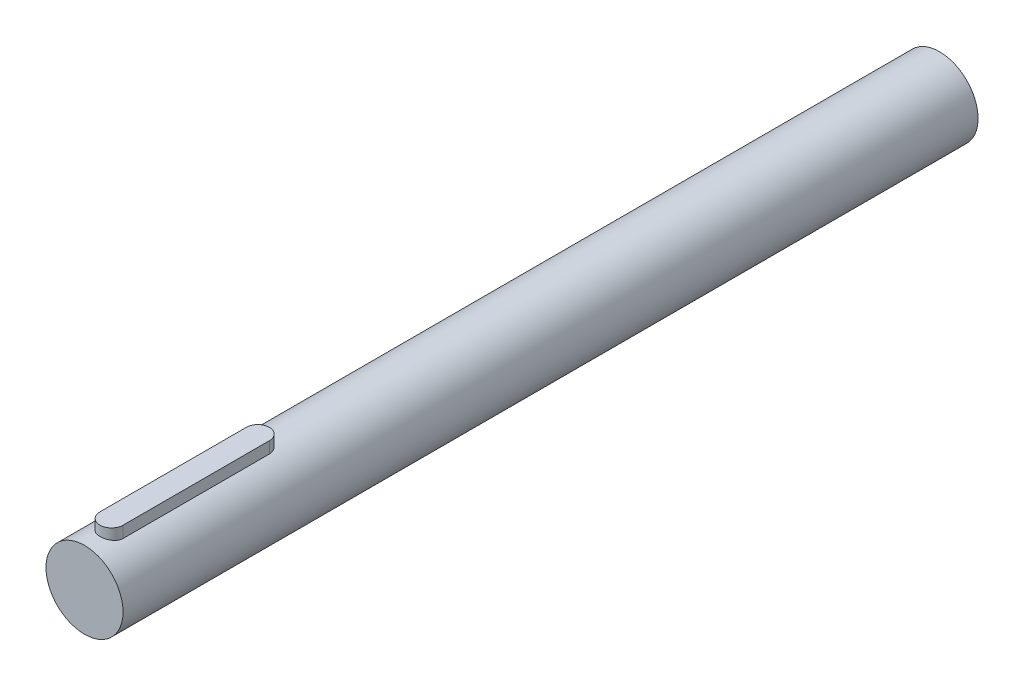
ISO-10303-21;
HEADER;
FILE_DESCRIPTION(('STEP AP214'),'2;1');
FILE_NAME('part.step','',(''),(''),'','','');
FILE_SCHEMA(('AUTOMOTIVE_DESIGN { 1 0 10303 214 1 1 1 1 }'));
ENDSEC;
DATA;
#1=APPLICATION_CONTEXT('core data for automotive mechanical design processes');
#2=APPLICATION_PROTOCOL_DEFINITION('international standard','automotive_design',2000,#1);
#3=PRODUCT_CONTEXT('',#1,'mechanical');
#4=PRODUCT('Part','Part','',(#3));
#5=PRODUCT_RELATED_PRODUCT_CATEGORY('part','',(#4));
#6=PRODUCT_DEFINITION_FORMATION('','',#4);
#7=PRODUCT_DEFINITION_CONTEXT('part definition',#1,'design');
#8=PRODUCT_DEFINITION('design','',#6,#7);
#9=PRODUCT_DEFINITION_SHAPE('','',#8);
#10=(LENGTH_UNIT() NAMED_UNIT(*) SI_UNIT(.MILLI.,.METRE.));
#11=(NAMED_UNIT(*) PLANE_ANGLE_UNIT() SI_UNIT($,.RADIAN.));
#12=(NAMED_UNIT(*) SI_UNIT($,.STERADIAN.) SOLID_ANGLE_UNIT());
#13=UNCERTAINTY_MEASURE_WITH_UNIT(LENGTH_MEASURE(1.E-05),#10,'distance_accuracy_value','');
#14=(GEOMETRIC_REPRESENTATION_CONTEXT(3) GLOBAL_UNCERTAINTY_ASSIGNED_CONTEXT((#13)) GLOBAL_UNIT_ASSIGNED_CONTEXT((#10,
#11,#12)) REPRESENTATION_CONTEXT('',''));
#15=CARTESIAN_POINT('',(0.,0.,0.));
#16=DIRECTION('',(0.,0.,1.));
#17=DIRECTION('',(1.,0.,0.));
#18=AXIS2_PLACEMENT_3D('',#15,#16,#17);
#19=CARTESIAN_POINT('',(2.77555756156289E-12,2.22044604925031E-13,26.));
#20=DIRECTION('',(0.,0.,-1.));
#21=DIRECTION('',(-1.,0.,0.));
#22=AXIS2_PLACEMENT_3D('',#19,#20,#21);
#23=CYLINDRICAL_SURFACE('',#22,5.);
#24=CARTESIAN_POINT('',(-1.50000000000006,4.76969600708466,22.4999999999989));
#25=CARTESIAN_POINT('',(-1.50000085357051,4.76969249084897,22.541179392907));
#26=CARTESIAN_POINT('',(-1.49830317083421,4.77022997000072,22.5823380431252));
#27=CARTESIAN_POINT('',(-1.49153785660337,4.77235095109922,22.6643411620948));
#28=CARTESIAN_POINT('',(-1.48647098275877,4.77393421787299,22.7051856993941));
#29=CARTESIAN_POINT('',(-1.46630203689278,4.78018490618824,22.8265905409537));
#30=CARTESIAN_POINT('',(-1.4462312041343,4.78635370384284,22.9063063904149));
#31=CARTESIAN_POINT('',(-1.39353102315403,4.80195952113218,23.0610355783847));
#32=CARTESIAN_POINT('',(-1.36090607068195,4.81139539670342,23.1360505521977));
#33=CARTESIAN_POINT('',(-1.28407841117721,4.83246571211979,23.2795966815968));
#34=CARTESIAN_POINT('',(-1.23987031651151,4.84410117434897,23.3481247997264));
#35=CARTESIAN_POINT('',(-1.13964850658231,4.86866835244696,23.4788660559951));
#36=CARTESIAN_POINT('',(-1.08333433465239,4.8816275541292,23.5408436603427));
#37=CARTESIAN_POINT('',(-0.961138919874051,4.90714811559011,23.6546355838997));
#38=CARTESIAN_POINT('',(-0.895256063916175,4.91970940785255,23.7064481860019));
#39=CARTESIAN_POINT('',(-0.754109921314739,4.94333239727727,23.7994637703174));
#40=CARTESIAN_POINT('',(-0.67868081933595,4.95435770971347,23.8404251802977));
#41=CARTESIAN_POINT('',(-0.521621185505634,4.97334469846198,23.9089884116185));
#42=CARTESIAN_POINT('',(-0.439992259012578,4.98130716463919,23.9365936777943));
#43=CARTESIAN_POINT('',(-0.275324697874311,4.99307639935035,23.976879799102));
#44=CARTESIAN_POINT('',(-0.192393125293673,4.99699549277019,23.98996485797));
#45=CARTESIAN_POINT('',(-0.0254235719974183,5.00063202022435,24.002117341363));
#46=CARTESIAN_POINT('',(0.0586141962430961,5.00035024971469,24.0011874196991));
#47=CARTESIAN_POINT('',(0.222571599946755,4.99569602566282,23.9856070912399));
#48=CARTESIAN_POINT('',(0.302537145465313,4.99145415509232,23.9713946550208));
#49=CARTESIAN_POINT('',(0.45889005210242,4.97951513700014,23.930368364762));
#50=CARTESIAN_POINT('',(0.53527722553218,4.97181780846023,23.9035538505441));
#51=CARTESIAN_POINT('',(0.683347815892333,4.95365214926158,23.8377877783534));
#52=CARTESIAN_POINT('',(0.754966006044376,4.94315255692596,23.7986983556426));
#53=CARTESIAN_POINT('',(0.890765529575241,4.92049624651804,23.7096014099514));
#54=CARTESIAN_POINT('',(0.954945191615885,4.90833915735856,23.6595914405213));
#55=CARTESIAN_POINT('',(1.07665450541394,4.88311673571392,23.5478080119165));
#56=CARTESIAN_POINT('',(1.13383351478097,4.87003445449632,23.4856561362388));
#57=CARTESIAN_POINT('',(1.23706769492501,4.84484215114741,23.3525025765715));
#58=CARTESIAN_POINT('',(1.28311962013097,4.83273241337556,23.2814983196343));
#59=CARTESIAN_POINT('',(1.3631640724088,4.81077228795658,23.1317190715508));
#60=CARTESIAN_POINT('',(1.39703006341141,4.80094596246063,23.0528728204065));
#61=CARTESIAN_POINT('',(1.45085886004699,4.78495663653293,22.8902754960181));
#62=CARTESIAN_POINT('',(1.47084293218039,4.77878803475836,22.8065321392856));
#63=CARTESIAN_POINT('',(1.48901203590081,4.77314032325039,22.6850051109298));
#64=CARTESIAN_POINT('',(1.49313202989009,4.77185156275356,22.6481092658204));
#65=CARTESIAN_POINT('',(1.49862355614854,4.77012928611911,22.5741485209005));
#66=CARTESIAN_POINT('',(1.49999912968269,4.76969451246757,22.5370839503361));
#67=CARTESIAN_POINT('',(1.50000000000006,4.76969600708466,22.5));
#68=B_SPLINE_CURVE_WITH_KNOTS('',3,(#24,#25,#26,#27,#28,#29,#30,#31,#32,#33,#34,#35,#36,#37,#38,
#39,#40,#41,#42,#43,#44,#45,#46,#47,#48,#49,#50,#51,#52,#53,#54,#55,#56,#57,#58,#59,#60,#61,#62,
#63,#64,#65,#66,#67),.UNSPECIFIED.,.F.,.F.,(4,2,2,2,2,2,2,2,2,2,2,2,2,2,2,2,2,2,2,2,2,4),(0.,
0.123459071220104,0.246890388853195,0.492911349615828,0.738846245884347,0.984895736827373,
1.23795510798765,1.49105719006945,1.749393561975,2.00766326783322,2.2585475131988,
2.50938425289577,2.75223130013024,2.99509107067836,3.24078242562791,3.48652887757125,
3.74172568311051,3.99699683536803,4.2548469807155,4.51230123440222,4.62365084745821,
4.73483637253627),.UNSPECIFIED.);
#69=CARTESIAN_POINT('',(-1.50000000000006,4.76969600708466,22.4999999999989));
#70=VERTEX_POINT('',#69);
#71=CARTESIAN_POINT('',(1.50000000000006,4.76969600708466,22.5));
#72=VERTEX_POINT('',#71);
#73=EDGE_CURVE('E121',#70,#72,#68,.T.);
#74=ORIENTED_EDGE('',*,*,#73,.F.);
#75=DIRECTION('',(0.,0.,-1.));
#76=VECTOR('',#75,1.);
#77=CARTESIAN_POINT('',(-1.49999999999872,4.76969600708488,25.9999999999989));
#78=LINE('',#77,#76);
#79=CARTESIAN_POINT('',(-1.49999999999995,4.76969600708466,3.49999999999889));
#80=VERTEX_POINT('',#79);
#81=EDGE_CURVE('E130',#80,#70,#78,.F.);
#82=ORIENTED_EDGE('',*,*,#81,.F.);
#83=CARTESIAN_POINT('',(1.50000000000028,4.7696960070851,3.5));
#84=CARTESIAN_POINT('',(1.50000085357093,4.76969249085003,3.45882060709196));
#85=CARTESIAN_POINT('',(1.49830317083449,4.7702299700022,3.41766195687382));
#86=CARTESIAN_POINT('',(1.49153785660338,4.77235095110112,3.3356588379043));
#87=CARTESIAN_POINT('',(1.48647098275863,4.7739342178749,3.29481430060492));
#88=CARTESIAN_POINT('',(1.46630203689325,4.78018490618952,3.17340945904518));
#89=CARTESIAN_POINT('',(1.44623120413659,4.78635370384281,3.09369360958353));
#90=CARTESIAN_POINT('',(1.39353102315628,4.80195952113225,2.93896442161417));
#91=CARTESIAN_POINT('',(1.36090607068227,4.81139539670492,2.86394944780202));
#92=CARTESIAN_POINT('',(1.28407841117682,4.83246571212135,2.72040331840244));
#93=CARTESIAN_POINT('',(1.23987031651232,4.84410117434919,2.65187520027147));
#94=CARTESIAN_POINT('',(1.13964850658322,4.86866835244709,2.52113394400327));
#95=CARTESIAN_POINT('',(1.0833343346522,4.88162755413068,2.45915633965745));
#96=CARTESIAN_POINT('',(0.961138919874682,4.90714811559086,2.34536441610013));
#97=CARTESIAN_POINT('',(0.895256063918744,4.91970940785122,2.29355181399574));
#98=CARTESIAN_POINT('',(0.754109921318076,4.94333239727558,2.20053622968021));
#99=CARTESIAN_POINT('',(0.678680819337999,4.95435770971354,2.1595748197021));
#100=CARTESIAN_POINT('',(0.521621185506436,4.9733446984629,2.09101158838266));
#101=CARTESIAN_POINT('',(0.439992259013411,4.98130716463919,2.06340632220596));
#102=CARTESIAN_POINT('',(0.275324697875332,4.99307639934988,2.02312020089785));
#103=CARTESIAN_POINT('',(0.192393125294886,4.99699549277013,2.01003514203028));
#104=CARTESIAN_POINT('',(0.0254235719990947,5.00063202022458,1.99788265863681));
#105=CARTESIAN_POINT('',(-0.0586141962411476,5.0003502497148,1.99881258029983));
#106=CARTESIAN_POINT('',(-0.222571599944496,4.9956960256627,2.01439290875904));
#107=CARTESIAN_POINT('',(-0.302537145463017,4.99145415509206,2.02860534497892));
#108=CARTESIAN_POINT('',(-0.458890052100688,4.97951513699985,2.06963163523724));
#109=CARTESIAN_POINT('',(-0.535277225531051,4.97181780846004,2.09644614945384));
#110=CARTESIAN_POINT('',(-0.683347815891191,4.95365214926114,2.16221222164415));
#111=CARTESIAN_POINT('',(-0.75496600604263,4.94315255692517,2.20130164435574));
#112=CARTESIAN_POINT('',(-0.890765529572809,4.92049624651767,2.29039859004776));
#113=CARTESIAN_POINT('',(-0.954945191613368,4.90833915735894,2.34040855947783));
#114=CARTESIAN_POINT('',(-1.0766545054118,4.88311673571392,2.4521919880822));
#115=CARTESIAN_POINT('',(-1.13383351477926,4.87003445449512,2.51434386375959));
#116=CARTESIAN_POINT('',(-1.23706769492381,4.84484215114661,2.6474974234269));
#117=CARTESIAN_POINT('',(-1.28311962012986,4.83273241337639,2.71850168036449));
#118=CARTESIAN_POINT('',(-1.36316407240787,4.8107722879571,2.86828092844818));
#119=CARTESIAN_POINT('',(-1.39703006341059,4.80094596245917,2.94712717959224));
#120=CARTESIAN_POINT('',(-1.45085886004653,4.78495663653147,3.10972450398057));
#121=CARTESIAN_POINT('',(-1.47084293218019,4.77878803475886,3.19346786071324));
#122=CARTESIAN_POINT('',(-1.48901203590058,4.77314032324986,3.3149948890691));
#123=CARTESIAN_POINT('',(-1.4931320298898,4.77185156275221,3.35189073417851));
#124=CARTESIAN_POINT('',(-1.49862355614822,4.77012928611717,3.42585147909843));
#125=CARTESIAN_POINT('',(-1.49999912968241,4.76969451246584,3.46291604966275));
#126=CARTESIAN_POINT('',(-1.49999999999995,4.76969600708466,3.49999999999889));
#127=B_SPLINE_CURVE_WITH_KNOTS('',3,(#83,#84,#85,#86,#87,#88,#89,#90,#91,#92,#93,#94,#95,#96,
#97,#98,#99,#100,#101,#102,#103,#104,#105,#106,#107,#108,#109,#110,#111,#112,#113,#114,#115,
#116,#117,#118,#119,#120,#121,#122,#123,#124,#125,#126),.UNSPECIFIED.,.F.,.F.,(4,2,2,2,2,2,2,2,
2,2,2,2,2,2,2,2,2,2,2,2,2,4),(0.,0.123459071219843,0.246890388853286,0.492911349615231,
0.73884624588421,0.984895736828108,1.23795510798734,1.49105719006767,1.74939356197371,
2.00766326783281,2.25854751319766,2.50938425289369,2.7522313001286,2.99509107067711,
3.24078242562616,3.48652887756918,3.74172568310901,3.99699683536695,4.25484698071459,
4.51230123440154,4.62365084745755,4.73483637253561),.UNSPECIFIED.);
#128=CARTESIAN_POINT('',(1.50000000000028,4.7696960070851,3.5));
#129=VERTEX_POINT('',#128);
#130=EDGE_CURVE('E66',#129,#80,#127,.T.);
#131=ORIENTED_EDGE('',*,*,#130,.F.);
#132=DIRECTION('',(0.,0.,-1.));
#133=VECTOR('',#132,1.);
#134=CARTESIAN_POINT('',(1.50000000000083,4.76969600708488,26.));
#135=LINE('',#134,#133);
#136=EDGE_CURVE('E88',#72,#129,#135,.T.);
#137=ORIENTED_EDGE('',*,*,#136,.F.);
#138=EDGE_LOOP('',(#74,#82,#131,#137));
#139=FACE_BOUND('',#138,.T.);
#140=CARTESIAN_POINT('',(2.77555756156289E-12,2.22044604925031E-13,26.));
#141=DIRECTION('',(0.,0.,1.));
#142=DIRECTION('',(1.,0.,0.));
#143=AXIS2_PLACEMENT_3D('',#140,#141,#142);
#144=CIRCLE('',#143,5.);
#145=CARTESIAN_POINT('',(5.00000000000278,2.22322160681188E-13,26.));
#146=VERTEX_POINT('',#145);
#147=EDGE_CURVE('E11',#146,#146,#144,.T.);
#148=ORIENTED_EDGE('',*,*,#147,.F.);
#149=EDGE_LOOP('',(#148));
#150=FACE_BOUND('',#149,.T.);
#151=CARTESIAN_POINT('',(1.11022302462516E-13,0.,-85.));
#152=DIRECTION('',(0.,0.,-1.));
#153=DIRECTION('',(-1.,0.,0.));
#154=AXIS2_PLACEMENT_3D('',#151,#152,#153);
#155=CIRCLE('',#154,5.);
#156=CARTESIAN_POINT('',(-4.99999999999989,0.,-85.));
#157=VERTEX_POINT('',#156);
#158=EDGE_CURVE('E51',#157,#157,#155,.T.);
#159=ORIENTED_EDGE('',*,*,#158,.F.);
#160=EDGE_LOOP('',(#159));
#161=FACE_BOUND('',#160,.T.);
#162=ADVANCED_FACE('F43',(#139,#150,#161),#23,.T.);
#163=CARTESIAN_POINT('',(2.77555756156289E-12,2.22044604925031E-13,26.));
#164=DIRECTION('',(0.,0.,1.));
#165=DIRECTION('',(1.,0.,0.));
#166=AXIS2_PLACEMENT_3D('',#163,#164,#165);
#167=PLANE('',#166);
#168=ORIENTED_EDGE('',*,*,#147,.T.);
#169=EDGE_LOOP('',(#168));
#170=FACE_BOUND('',#169,.T.);
#171=ADVANCED_FACE('F154',(#170),#167,.T.);
#172=CARTESIAN_POINT('',(1.11022302462516E-13,0.,-85.));
#173=DIRECTION('',(0.,0.,-1.));
#174=DIRECTION('',(-1.,0.,0.));
#175=AXIS2_PLACEMENT_3D('',#172,#173,#174);
#176=PLANE('',#175);
#177=ORIENTED_EDGE('',*,*,#158,.T.);
#178=EDGE_LOOP('',(#177));
#179=FACE_BOUND('',#178,.T.);
#180=ADVANCED_FACE('F140',(#179),#176,.T.);
#181=CARTESIAN_POINT('',(-1.49999999999995,-5.00200000000017,3.49999999999889));
#182=DIRECTION('',(-1.,0.,0.));
#183=DIRECTION('',(0.,0.,1.));
#184=AXIS2_PLACEMENT_3D('',#181,#182,#183);
#185=PLANE('',#184);
#186=DIRECTION('',(0.,1.,0.));
#187=VECTOR('',#186,1.);
#188=CARTESIAN_POINT('',(-1.49999999999995,-5.00200000000017,3.49999999999889));
#189=LINE('',#188,#187);
#190=CARTESIAN_POINT('',(-1.49999999999939,6.26900000000008,3.49999999999995));
#191=VERTEX_POINT('',#190);
#192=EDGE_CURVE('E102',#80,#191,#189,.T.);
#193=ORIENTED_EDGE('',*,*,#192,.F.);
#194=ORIENTED_EDGE('',*,*,#81,.T.);
#195=DIRECTION('',(0.,1.,0.));
#196=VECTOR('',#195,1.);
#197=CARTESIAN_POINT('',(-1.50000000000006,-5.00200000000006,22.4999999999989));
#198=LINE('',#197,#196);
#199=CARTESIAN_POINT('',(-1.50000000000006,6.26900000000008,22.5));
#200=VERTEX_POINT('',#199);
#201=EDGE_CURVE('E114',#70,#200,#198,.T.);
#202=ORIENTED_EDGE('',*,*,#201,.T.);
#203=DIRECTION('',(0.,0.,1.));
#204=VECTOR('',#203,1.);
#205=CARTESIAN_POINT('',(-1.49999999999939,6.26900000000008,3.49999999999995));
#206=LINE('',#205,#204);
#207=EDGE_CURVE('E105',#191,#200,#206,.T.);
#208=ORIENTED_EDGE('',*,*,#207,.F.);
#209=EDGE_LOOP('',(#193,#194,#202,#208));
#210=FACE_BOUND('',#209,.T.);
#211=ADVANCED_FACE('F169',(#210),#185,.T.);
#212=CARTESIAN_POINT('',(0.,6.26900000000008,3.49999999999995));
#213=DIRECTION('',(0.,1.,0.));
#214=DIRECTION('',(0.,0.,1.));
#215=AXIS2_PLACEMENT_3D('',#212,#213,#214);
#216=PLANE('',#215);
#217=CARTESIAN_POINT('',(0.,6.26900000000008,3.49999999999995));
#218=DIRECTION('',(0.,1.,0.));
#219=DIRECTION('',(0.,0.,1.));
#220=AXIS2_PLACEMENT_3D('',#217,#218,#219);
#221=CIRCLE('',#220,1.5);
#222=CARTESIAN_POINT('',(1.50000000000028,6.26899999999986,3.49999999999889));
#223=VERTEX_POINT('',#222);
#224=EDGE_CURVE('E96',#223,#191,#221,.T.);
#225=ORIENTED_EDGE('',*,*,#224,.T.);
#226=ORIENTED_EDGE('',*,*,#207,.T.);
#227=CARTESIAN_POINT('',(-1.11022302462516E-13,6.26900000000008,22.5));
#228=DIRECTION('',(0.,1.,0.));
#229=DIRECTION('',(0.,0.,1.));
#230=AXIS2_PLACEMENT_3D('',#227,#228,#229);
#231=CIRCLE('',#230,1.5);
#232=CARTESIAN_POINT('',(1.50000000000006,6.26900000000008,22.4999999999989));
#233=VERTEX_POINT('',#232);
#234=EDGE_CURVE('E98',#200,#233,#231,.T.);
#235=ORIENTED_EDGE('',*,*,#234,.T.);
#236=DIRECTION('',(0.,0.,-1.));
#237=VECTOR('',#236,1.);
#238=CARTESIAN_POINT('',(1.50000000000028,6.26899999999986,3.49999999999889));
#239=LINE('',#238,#237);
#240=EDGE_CURVE('E85',#233,#223,#239,.T.);
#241=ORIENTED_EDGE('',*,*,#240,.T.);
#242=EDGE_LOOP('',(#225,#226,#235,#241));
#243=FACE_BOUND('',#242,.T.);
#244=ADVANCED_FACE('F94',(#243),#216,.T.);
#245=CARTESIAN_POINT('',(2.22044604925031E-13,-5.00200000000017,3.5));
#246=DIRECTION('',(0.,1.,0.));
#247=DIRECTION('',(0.,0.,1.));
#248=AXIS2_PLACEMENT_3D('',#245,#246,#247);
#249=CYLINDRICAL_SURFACE('',#248,1.5);
#250=DIRECTION('',(0.,1.,0.));
#251=VECTOR('',#250,1.);
#252=CARTESIAN_POINT('',(1.50000000000006,-5.00199999999995,3.5));
#253=LINE('',#252,#251);
#254=EDGE_CURVE('E82',#129,#223,#253,.T.);
#255=ORIENTED_EDGE('',*,*,#254,.F.);
#256=ORIENTED_EDGE('',*,*,#130,.T.);
#257=ORIENTED_EDGE('',*,*,#192,.T.);
#258=ORIENTED_EDGE('',*,*,#224,.F.);
#259=EDGE_LOOP('',(#255,#256,#257,#258));
#260=FACE_BOUND('',#259,.T.);
#261=ADVANCED_FACE('F101',(#260),#249,.T.);
#262=CARTESIAN_POINT('',(0.,-5.00199999999995,22.5));
#263=DIRECTION('',(0.,1.,0.));
#264=DIRECTION('',(0.,0.,1.));
#265=AXIS2_PLACEMENT_3D('',#262,#263,#264);
#266=CYLINDRICAL_SURFACE('',#265,1.5);
#267=ORIENTED_EDGE('',*,*,#201,.F.);
#268=ORIENTED_EDGE('',*,*,#73,.T.);
#269=DIRECTION('',(0.,1.,0.));
#270=VECTOR('',#269,1.);
#271=CARTESIAN_POINT('',(1.49999999999995,-5.00199999999995,22.5));
#272=LINE('',#271,#270);
#273=EDGE_CURVE('E58',#72,#233,#272,.T.);
#274=ORIENTED_EDGE('',*,*,#273,.T.);
#275=ORIENTED_EDGE('',*,*,#234,.F.);
#276=EDGE_LOOP('',(#267,#268,#274,#275));
#277=FACE_BOUND('',#276,.T.);
#278=ADVANCED_FACE('F132',(#277),#266,.T.);
#279=CARTESIAN_POINT('',(1.50000000000006,-5.00199999999995,3.5));
#280=DIRECTION('',(1.,0.,0.));
#281=DIRECTION('',(0.,0.,-1.));
#282=AXIS2_PLACEMENT_3D('',#279,#280,#281);
#283=PLANE('',#282);
#284=ORIENTED_EDGE('',*,*,#273,.F.);
#285=ORIENTED_EDGE('',*,*,#136,.T.);
#286=ORIENTED_EDGE('',*,*,#254,.T.);
#287=ORIENTED_EDGE('',*,*,#240,.F.);
#288=EDGE_LOOP('',(#284,#285,#286,#287));
#289=FACE_BOUND('',#288,.T.);
#290=ADVANCED_FACE('F84',(#289),#283,.T.);
#291=CLOSED_SHELL('',(#162,#171,#180,#211,#244,#261,#278,#290));
#292=MANIFOLD_SOLID_BREP('B2',#291);
#293=ADVANCED_BREP_SHAPE_REPRESENTATION('',(#18,#292),#14);
#294=SHAPE_DEFINITION_REPRESENTATION(#9,#293);
ENDSEC;
END-ISO-10303-21;
